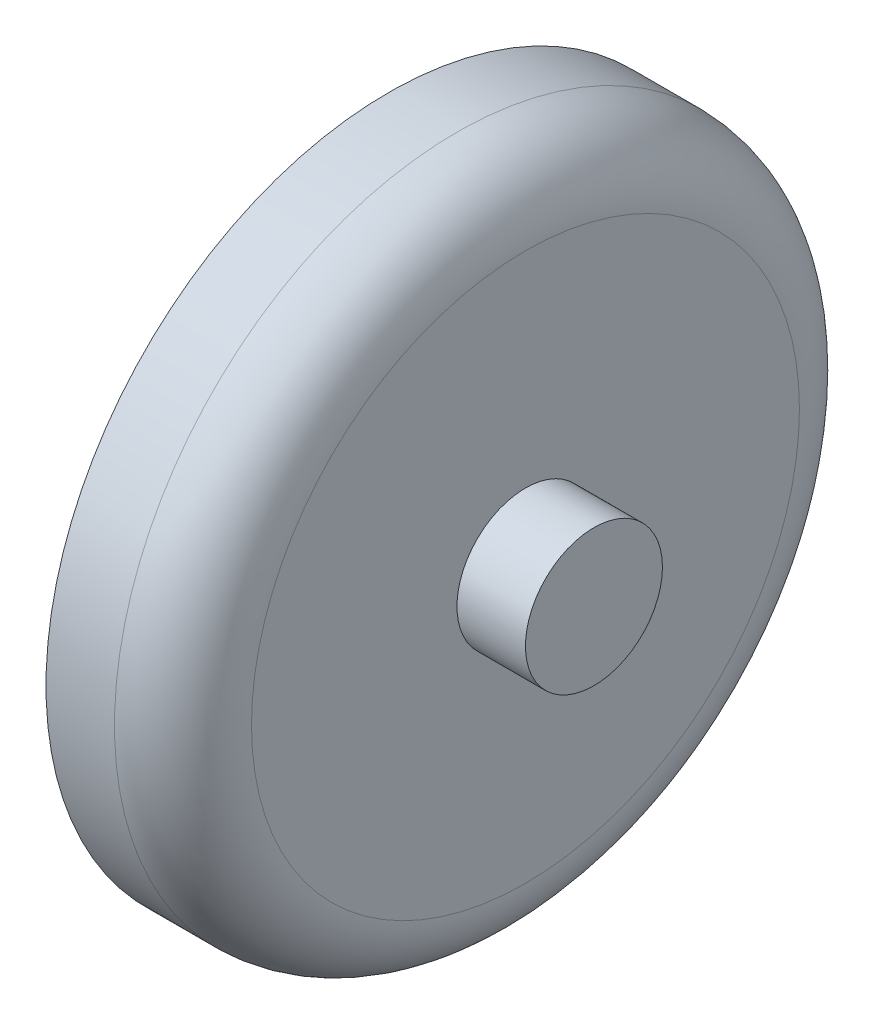
ISO-10303-21;
HEADER;
FILE_DESCRIPTION(('STEP AP214'),'2;1');
FILE_NAME('part.step','',(''),(''),'','','');
FILE_SCHEMA(('AUTOMOTIVE_DESIGN { 1 0 10303 214 1 1 1 1 }'));
ENDSEC;
DATA;
#1=APPLICATION_CONTEXT('core data for automotive mechanical design processes');
#2=APPLICATION_PROTOCOL_DEFINITION('international standard','automotive_design',2000,#1);
#3=PRODUCT_CONTEXT('',#1,'mechanical');
#4=PRODUCT('Part','Part','',(#3));
#5=PRODUCT_RELATED_PRODUCT_CATEGORY('part','',(#4));
#6=PRODUCT_DEFINITION_FORMATION('','',#4);
#7=PRODUCT_DEFINITION_CONTEXT('part definition',#1,'design');
#8=PRODUCT_DEFINITION('design','',#6,#7);
#9=PRODUCT_DEFINITION_SHAPE('','',#8);
#10=(LENGTH_UNIT() NAMED_UNIT(*) SI_UNIT(.MILLI.,.METRE.));
#11=(NAMED_UNIT(*) PLANE_ANGLE_UNIT() SI_UNIT($,.RADIAN.));
#12=(NAMED_UNIT(*) SI_UNIT($,.STERADIAN.) SOLID_ANGLE_UNIT());
#13=UNCERTAINTY_MEASURE_WITH_UNIT(LENGTH_MEASURE(1.E-05),#10,'distance_accuracy_value','');
#14=(GEOMETRIC_REPRESENTATION_CONTEXT(3) GLOBAL_UNCERTAINTY_ASSIGNED_CONTEXT((#13)) GLOBAL_UNIT_ASSIGNED_CONTEXT((#10,
#11,#12)) REPRESENTATION_CONTEXT('',''));
#15=CARTESIAN_POINT('',(0.,0.,0.));
#16=DIRECTION('',(0.,0.,1.));
#17=DIRECTION('',(1.,0.,0.));
#18=AXIS2_PLACEMENT_3D('',#15,#16,#17);
#19=CARTESIAN_POINT('',(10.,0.,0.));
#20=DIRECTION('',(-1.,0.,0.));
#21=DIRECTION('',(0.,0.,1.));
#22=AXIS2_PLACEMENT_3D('',#19,#20,#21);
#23=CYLINDRICAL_SURFACE('',#22,25.);
#24=CARTESIAN_POINT('',(5.,0.,0.));
#25=DIRECTION('',(1.,0.,0.));
#26=DIRECTION('',(0.,0.,-1.));
#27=AXIS2_PLACEMENT_3D('',#24,#25,#26);
#28=CIRCLE('',#27,25.);
#29=CARTESIAN_POINT('',(5.,0.,-25.));
#30=VERTEX_POINT('',#29);
#31=EDGE_CURVE('E10',#30,#30,#28,.F.);
#32=ORIENTED_EDGE('',*,*,#31,.T.);
#33=EDGE_LOOP('',(#32));
#34=FACE_BOUND('',#33,.T.);
#35=CARTESIAN_POINT('',(0.,0.,0.));
#36=DIRECTION('',(1.,0.,0.));
#37=DIRECTION('',(0.,0.,-1.));
#38=AXIS2_PLACEMENT_3D('',#35,#36,#37);
#39=CIRCLE('',#38,25.);
#40=CARTESIAN_POINT('',(0.,0.,-25.));
#41=VERTEX_POINT('',#40);
#42=EDGE_CURVE('E50',#41,#41,#39,.T.);
#43=ORIENTED_EDGE('',*,*,#42,.T.);
#44=EDGE_LOOP('',(#43));
#45=FACE_BOUND('',#44,.T.);
#46=ADVANCED_FACE('F37',(#34,#45),#23,.T.);
#47=CARTESIAN_POINT('',(10.,0.,0.));
#48=DIRECTION('',(1.,0.,0.));
#49=DIRECTION('',(0.,0.,-1.));
#50=AXIS2_PLACEMENT_3D('',#47,#48,#49);
#51=PLANE('',#50);
#52=CARTESIAN_POINT('',(10.,0.,0.));
#53=DIRECTION('',(1.,0.,0.));
#54=DIRECTION('',(0.,0.,-1.));
#55=AXIS2_PLACEMENT_3D('',#52,#53,#54);
#56=CIRCLE('',#55,5.);
#57=CARTESIAN_POINT('',(10.,0.,-5.));
#58=VERTEX_POINT('',#57);
#59=EDGE_CURVE('E58',#58,#58,#56,.T.);
#60=ORIENTED_EDGE('',*,*,#59,.F.);
#61=EDGE_LOOP('',(#60));
#62=FACE_BOUND('',#61,.T.);
#63=CARTESIAN_POINT('',(10.,0.,0.));
#64=DIRECTION('',(1.,0.,0.));
#65=DIRECTION('',(0.,0.,-1.));
#66=AXIS2_PLACEMENT_3D('',#63,#64,#65);
#67=CIRCLE('',#66,20.);
#68=CARTESIAN_POINT('',(10.,0.,-20.));
#69=VERTEX_POINT('',#68);
#70=EDGE_CURVE('E45',#69,#69,#67,.T.);
#71=ORIENTED_EDGE('',*,*,#70,.T.);
#72=EDGE_LOOP('',(#71));
#73=FACE_BOUND('',#72,.T.);
#74=ADVANCED_FACE('F74',(#62,#73),#51,.T.);
#75=CARTESIAN_POINT('',(0.,0.,0.));
#76=DIRECTION('',(1.,0.,0.));
#77=DIRECTION('',(0.,0.,-1.));
#78=AXIS2_PLACEMENT_3D('',#75,#76,#77);
#79=PLANE('',#78);
#80=ORIENTED_EDGE('',*,*,#42,.F.);
#81=EDGE_LOOP('',(#80));
#82=FACE_BOUND('',#81,.T.);
#83=ADVANCED_FACE('F76',(#82),#79,.F.);
#84=CARTESIAN_POINT('',(5.,0.,0.));
#85=DIRECTION('',(1.,0.,0.));
#86=DIRECTION('',(0.,0.,-1.));
#87=AXIS2_PLACEMENT_3D('',#84,#85,#86);
#88=TOROIDAL_SURFACE('',#87,20.,5.);
#89=ORIENTED_EDGE('',*,*,#31,.F.);
#90=EDGE_LOOP('',(#89));
#91=FACE_BOUND('',#90,.T.);
#92=ORIENTED_EDGE('',*,*,#70,.F.);
#93=EDGE_LOOP('',(#92));
#94=FACE_BOUND('',#93,.T.);
#95=ADVANCED_FACE('F39',(#91,#94),#88,.T.);
#96=CARTESIAN_POINT('',(15.,0.,0.));
#97=DIRECTION('',(-1.,0.,0.));
#98=DIRECTION('',(0.,0.,1.));
#99=AXIS2_PLACEMENT_3D('',#96,#97,#98);
#100=CYLINDRICAL_SURFACE('',#99,5.);
#101=CARTESIAN_POINT('',(15.,0.,0.));
#102=DIRECTION('',(1.,0.,0.));
#103=DIRECTION('',(0.,0.,-1.));
#104=AXIS2_PLACEMENT_3D('',#101,#102,#103);
#105=CIRCLE('',#104,5.);
#106=CARTESIAN_POINT('',(15.,0.,-5.));
#107=VERTEX_POINT('',#106);
#108=EDGE_CURVE('E55',#107,#107,#105,.T.);
#109=ORIENTED_EDGE('',*,*,#108,.F.);
#110=EDGE_LOOP('',(#109));
#111=FACE_BOUND('',#110,.T.);
#112=ORIENTED_EDGE('',*,*,#59,.T.);
#113=EDGE_LOOP('',(#112));
#114=FACE_BOUND('',#113,.T.);
#115=ADVANCED_FACE('F68',(#111,#114),#100,.T.);
#116=CARTESIAN_POINT('',(15.,0.,0.));
#117=DIRECTION('',(1.,0.,0.));
#118=DIRECTION('',(0.,0.,-1.));
#119=AXIS2_PLACEMENT_3D('',#116,#117,#118);
#120=PLANE('',#119);
#121=ORIENTED_EDGE('',*,*,#108,.T.);
#122=EDGE_LOOP('',(#121));
#123=FACE_BOUND('',#122,.T.);
#124=ADVANCED_FACE('F66',(#123),#120,.T.);
#125=CLOSED_SHELL('',(#46,#74,#83,#95,#115,#124));
#126=MANIFOLD_SOLID_BREP('B2',#125);
#127=ADVANCED_BREP_SHAPE_REPRESENTATION('',(#18,#126),#14);
#128=SHAPE_DEFINITION_REPRESENTATION(#9,#127);
ENDSEC;
END-ISO-10303-21;
